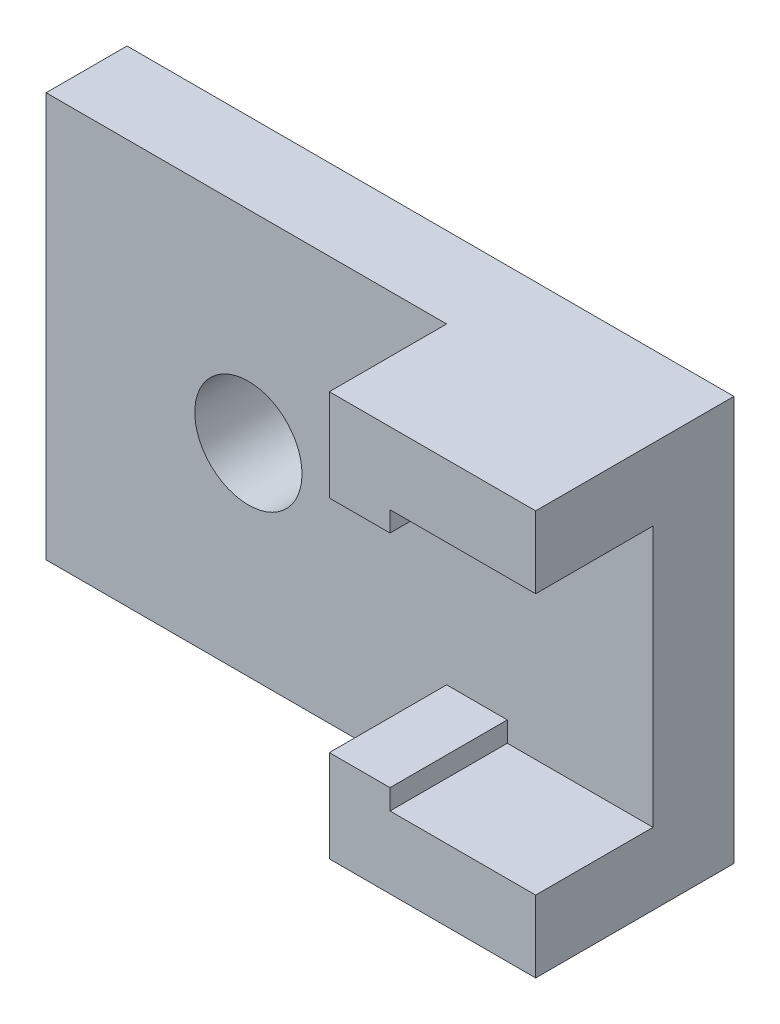
ISO-10303-21;
HEADER;
FILE_DESCRIPTION(('STEP AP214'),'2;1');
FILE_NAME('part.step','',(''),(''),'','','');
FILE_SCHEMA(('AUTOMOTIVE_DESIGN { 1 0 10303 214 1 1 1 1 }'));
ENDSEC;
DATA;
#1=APPLICATION_CONTEXT('core data for automotive mechanical design processes');
#2=APPLICATION_PROTOCOL_DEFINITION('international standard','automotive_design',2000,#1);
#3=PRODUCT_CONTEXT('',#1,'mechanical');
#4=PRODUCT('Part','Part','',(#3));
#5=PRODUCT_RELATED_PRODUCT_CATEGORY('part','',(#4));
#6=PRODUCT_DEFINITION_FORMATION('','',#4);
#7=PRODUCT_DEFINITION_CONTEXT('part definition',#1,'design');
#8=PRODUCT_DEFINITION('design','',#6,#7);
#9=PRODUCT_DEFINITION_SHAPE('','',#8);
#10=(LENGTH_UNIT() NAMED_UNIT(*) SI_UNIT(.MILLI.,.METRE.));
#11=(NAMED_UNIT(*) PLANE_ANGLE_UNIT() SI_UNIT($,.RADIAN.));
#12=(NAMED_UNIT(*) SI_UNIT($,.STERADIAN.) SOLID_ANGLE_UNIT());
#13=UNCERTAINTY_MEASURE_WITH_UNIT(LENGTH_MEASURE(1.E-05),#10,'distance_accuracy_value','');
#14=(GEOMETRIC_REPRESENTATION_CONTEXT(3) GLOBAL_UNCERTAINTY_ASSIGNED_CONTEXT((#13)) GLOBAL_UNIT_ASSIGNED_CONTEXT((#10,
#11,#12)) REPRESENTATION_CONTEXT('',''));
#15=CARTESIAN_POINT('',(0.,0.,0.));
#16=DIRECTION('',(0.,0.,1.));
#17=DIRECTION('',(1.,0.,0.));
#18=AXIS2_PLACEMENT_3D('',#15,#16,#17);
#19=CARTESIAN_POINT('',(0.,0.,4.));
#20=DIRECTION('',(1.,0.,0.));
#21=DIRECTION('',(0.,0.,-1.));
#22=AXIS2_PLACEMENT_3D('',#19,#20,#21);
#23=PLANE('',#22);
#24=DIRECTION('',(0.,-1.,0.));
#25=VECTOR('',#24,1.);
#26=CARTESIAN_POINT('',(0.,0.,0.));
#27=LINE('',#26,#25);
#28=CARTESIAN_POINT('',(0.,0.,0.));
#29=VERTEX_POINT('',#28);
#30=CARTESIAN_POINT('',(0.,-20.,0.));
#31=VERTEX_POINT('',#30);
#32=EDGE_CURVE('E226',#29,#31,#27,.T.);
#33=ORIENTED_EDGE('',*,*,#32,.T.);
#34=DIRECTION('',(0.,0.,-1.));
#35=VECTOR('',#34,1.);
#36=CARTESIAN_POINT('',(0.,-20.,4.));
#37=LINE('',#36,#35);
#38=CARTESIAN_POINT('',(0.,-20.,4.));
#39=VERTEX_POINT('',#38);
#40=EDGE_CURVE('E11',#39,#31,#37,.T.);
#41=ORIENTED_EDGE('',*,*,#40,.F.);
#42=DIRECTION('',(0.,-1.,0.));
#43=VECTOR('',#42,1.);
#44=CARTESIAN_POINT('',(0.,0.,4.));
#45=LINE('',#44,#43);
#46=CARTESIAN_POINT('',(0.,0.,4.));
#47=VERTEX_POINT('',#46);
#48=EDGE_CURVE('E229',#47,#39,#45,.T.);
#49=ORIENTED_EDGE('',*,*,#48,.F.);
#50=DIRECTION('',(0.,0.,-1.));
#51=VECTOR('',#50,1.);
#52=CARTESIAN_POINT('',(0.,0.,4.));
#53=LINE('',#52,#51);
#54=EDGE_CURVE('E239',#47,#29,#53,.T.);
#55=ORIENTED_EDGE('',*,*,#54,.T.);
#56=EDGE_LOOP('',(#33,#41,#49,#55));
#57=FACE_BOUND('',#56,.T.);
#58=ADVANCED_FACE('F35',(#57),#23,.F.);
#59=CARTESIAN_POINT('',(0.,-20.,4.));
#60=DIRECTION('',(0.,1.,0.));
#61=DIRECTION('',(0.,0.,1.));
#62=AXIS2_PLACEMENT_3D('',#59,#60,#61);
#63=PLANE('',#62);
#64=DIRECTION('',(1.,0.,0.));
#65=VECTOR('',#64,1.);
#66=CARTESIAN_POINT('',(0.,-20.,0.));
#67=LINE('',#66,#65);
#68=CARTESIAN_POINT('',(30.,-20.,0.));
#69=VERTEX_POINT('',#68);
#70=EDGE_CURVE('E242',#31,#69,#67,.T.);
#71=ORIENTED_EDGE('',*,*,#70,.T.);
#72=DIRECTION('',(0.,0.,-1.));
#73=VECTOR('',#72,1.);
#74=CARTESIAN_POINT('',(30.,-20.,4.));
#75=LINE('',#74,#73);
#76=CARTESIAN_POINT('',(30.,-20.,9.8));
#77=VERTEX_POINT('',#76);
#78=EDGE_CURVE('E42',#77,#69,#75,.T.);
#79=ORIENTED_EDGE('',*,*,#78,.F.);
#80=DIRECTION('',(1.,0.,0.));
#81=VECTOR('',#80,1.);
#82=CARTESIAN_POINT('',(0.,-20.,9.8));
#83=LINE('',#82,#81);
#84=CARTESIAN_POINT('',(19.8,-20.,9.8));
#85=VERTEX_POINT('',#84);
#86=EDGE_CURVE('E148',#85,#77,#83,.T.);
#87=ORIENTED_EDGE('',*,*,#86,.F.);
#88=DIRECTION('',(0.,0.,-1.));
#89=VECTOR('',#88,1.);
#90=CARTESIAN_POINT('',(19.8,-20.,9.8));
#91=LINE('',#90,#89);
#92=CARTESIAN_POINT('',(19.8,-20.,4.));
#93=VERTEX_POINT('',#92);
#94=EDGE_CURVE('E135',#85,#93,#91,.T.);
#95=ORIENTED_EDGE('',*,*,#94,.T.);
#96=DIRECTION('',(1.,0.,0.));
#97=VECTOR('',#96,1.);
#98=CARTESIAN_POINT('',(0.,-20.,4.));
#99=LINE('',#98,#97);
#100=EDGE_CURVE('E232',#39,#93,#99,.T.);
#101=ORIENTED_EDGE('',*,*,#100,.F.);
#102=ORIENTED_EDGE('',*,*,#40,.T.);
#103=EDGE_LOOP('',(#71,#79,#87,#95,#101,#102));
#104=FACE_BOUND('',#103,.T.);
#105=ADVANCED_FACE('F149',(#104),#63,.F.);
#106=CARTESIAN_POINT('',(30.,0.,4.));
#107=DIRECTION('',(-1.,0.,0.));
#108=DIRECTION('',(0.,-1.,0.));
#109=AXIS2_PLACEMENT_3D('',#106,#107,#108);
#110=PLANE('',#109);
#111=DIRECTION('',(0.,1.,0.));
#112=VECTOR('',#111,1.);
#113=CARTESIAN_POINT('',(30.,0.,0.));
#114=LINE('',#113,#112);
#115=CARTESIAN_POINT('',(30.,0.,0.));
#116=VERTEX_POINT('',#115);
#117=EDGE_CURVE('E244',#69,#116,#114,.T.);
#118=ORIENTED_EDGE('',*,*,#117,.T.);
#119=DIRECTION('',(0.,0.,-1.));
#120=VECTOR('',#119,1.);
#121=CARTESIAN_POINT('',(30.,0.,4.));
#122=LINE('',#121,#120);
#123=CARTESIAN_POINT('',(30.,0.,9.8));
#124=VERTEX_POINT('',#123);
#125=EDGE_CURVE('E249',#124,#116,#122,.T.);
#126=ORIENTED_EDGE('',*,*,#125,.F.);
#127=DIRECTION('',(0.,1.,0.));
#128=VECTOR('',#127,1.);
#129=CARTESIAN_POINT('',(30.,0.,9.8));
#130=LINE('',#129,#128);
#131=CARTESIAN_POINT('',(30.,-3.55,9.8));
#132=VERTEX_POINT('',#131);
#133=EDGE_CURVE('E198',#132,#124,#130,.T.);
#134=ORIENTED_EDGE('',*,*,#133,.F.);
#135=DIRECTION('',(0.,0.,-1.));
#136=VECTOR('',#135,1.);
#137=CARTESIAN_POINT('',(30.,-3.55,9.8));
#138=LINE('',#137,#136);
#139=CARTESIAN_POINT('',(30.,-3.55,4.));
#140=VERTEX_POINT('',#139);
#141=EDGE_CURVE('E201',#132,#140,#138,.T.);
#142=ORIENTED_EDGE('',*,*,#141,.T.);
#143=DIRECTION('',(0.,1.,0.));
#144=VECTOR('',#143,1.);
#145=CARTESIAN_POINT('',(30.,0.,4.));
#146=LINE('',#145,#144);
#147=CARTESIAN_POINT('',(30.,-16.45,4.));
#148=VERTEX_POINT('',#147);
#149=EDGE_CURVE('E235',#148,#140,#146,.T.);
#150=ORIENTED_EDGE('',*,*,#149,.F.);
#151=DIRECTION('',(0.,0.,-1.));
#152=VECTOR('',#151,1.);
#153=CARTESIAN_POINT('',(30.,-16.45,9.8));
#154=LINE('',#153,#152);
#155=CARTESIAN_POINT('',(30.,-16.45,9.8));
#156=VERTEX_POINT('',#155);
#157=EDGE_CURVE('E145',#156,#148,#154,.T.);
#158=ORIENTED_EDGE('',*,*,#157,.F.);
#159=DIRECTION('',(0.,1.,0.));
#160=VECTOR('',#159,1.);
#161=CARTESIAN_POINT('',(30.,0.,9.8));
#162=LINE('',#161,#160);
#163=EDGE_CURVE('E153',#77,#156,#162,.T.);
#164=ORIENTED_EDGE('',*,*,#163,.F.);
#165=ORIENTED_EDGE('',*,*,#78,.T.);
#166=EDGE_LOOP('',(#118,#126,#134,#142,#150,#158,#164,#165));
#167=FACE_BOUND('',#166,.T.);
#168=ADVANCED_FACE('F253',(#167),#110,.F.);
#169=CARTESIAN_POINT('',(0.,0.,4.));
#170=DIRECTION('',(0.,-1.,0.));
#171=DIRECTION('',(0.,0.,-1.));
#172=AXIS2_PLACEMENT_3D('',#169,#170,#171);
#173=PLANE('',#172);
#174=DIRECTION('',(-1.,0.,0.));
#175=VECTOR('',#174,1.);
#176=CARTESIAN_POINT('',(0.,0.,0.));
#177=LINE('',#176,#175);
#178=EDGE_CURVE('E233',#116,#29,#177,.T.);
#179=ORIENTED_EDGE('',*,*,#178,.T.);
#180=ORIENTED_EDGE('',*,*,#54,.F.);
#181=DIRECTION('',(-1.,0.,0.));
#182=VECTOR('',#181,1.);
#183=CARTESIAN_POINT('',(0.,0.,4.));
#184=LINE('',#183,#182);
#185=CARTESIAN_POINT('',(19.8,0.,4.));
#186=VERTEX_POINT('',#185);
#187=EDGE_CURVE('E237',#186,#47,#184,.T.);
#188=ORIENTED_EDGE('',*,*,#187,.F.);
#189=DIRECTION('',(0.,0.,-1.));
#190=VECTOR('',#189,1.);
#191=CARTESIAN_POINT('',(19.8,0.,9.8));
#192=LINE('',#191,#190);
#193=CARTESIAN_POINT('',(19.8,0.,9.8));
#194=VERTEX_POINT('',#193);
#195=EDGE_CURVE('E219',#194,#186,#192,.T.);
#196=ORIENTED_EDGE('',*,*,#195,.F.);
#197=DIRECTION('',(-1.,0.,0.));
#198=VECTOR('',#197,1.);
#199=CARTESIAN_POINT('',(0.,0.,9.8));
#200=LINE('',#199,#198);
#201=EDGE_CURVE('E185',#124,#194,#200,.T.);
#202=ORIENTED_EDGE('',*,*,#201,.F.);
#203=ORIENTED_EDGE('',*,*,#125,.T.);
#204=EDGE_LOOP('',(#179,#180,#188,#196,#202,#203));
#205=FACE_BOUND('',#204,.T.);
#206=ADVANCED_FACE('F261',(#205),#173,.F.);
#207=CARTESIAN_POINT('',(0.,0.,4.));
#208=DIRECTION('',(0.,0.,1.));
#209=DIRECTION('',(1.,0.,0.));
#210=AXIS2_PLACEMENT_3D('',#207,#208,#209);
#211=PLANE('',#210);
#212=DIRECTION('',(0.,1.,0.));
#213=VECTOR('',#212,1.);
#214=CARTESIAN_POINT('',(19.8,0.,4.));
#215=LINE('',#214,#213);
#216=CARTESIAN_POINT('',(19.8,-15.45,4.));
#217=VERTEX_POINT('',#216);
#218=EDGE_CURVE('E141',#93,#217,#215,.T.);
#219=ORIENTED_EDGE('',*,*,#218,.T.);
#220=DIRECTION('',(-1.,0.,0.));
#221=VECTOR('',#220,1.);
#222=CARTESIAN_POINT('',(0.,-15.45,4.));
#223=LINE('',#222,#221);
#224=CARTESIAN_POINT('',(22.8,-15.45,4.));
#225=VERTEX_POINT('',#224);
#226=EDGE_CURVE('E160',#225,#217,#223,.T.);
#227=ORIENTED_EDGE('',*,*,#226,.F.);
#228=DIRECTION('',(0.,-1.,0.));
#229=VECTOR('',#228,1.);
#230=CARTESIAN_POINT('',(22.8,0.,4.));
#231=LINE('',#230,#229);
#232=CARTESIAN_POINT('',(22.8,-16.45,4.));
#233=VERTEX_POINT('',#232);
#234=EDGE_CURVE('E49',#225,#233,#231,.T.);
#235=ORIENTED_EDGE('',*,*,#234,.T.);
#236=DIRECTION('',(1.,0.,0.));
#237=VECTOR('',#236,1.);
#238=CARTESIAN_POINT('',(0.,-16.45,4.));
#239=LINE('',#238,#237);
#240=EDGE_CURVE('E175',#233,#148,#239,.T.);
#241=ORIENTED_EDGE('',*,*,#240,.T.);
#242=ORIENTED_EDGE('',*,*,#149,.T.);
#243=DIRECTION('',(1.,0.,0.));
#244=VECTOR('',#243,1.);
#245=CARTESIAN_POINT('',(0.,-3.55,4.));
#246=LINE('',#245,#244);
#247=CARTESIAN_POINT('',(22.8,-3.55,4.));
#248=VERTEX_POINT('',#247);
#249=EDGE_CURVE('E57',#248,#140,#246,.T.);
#250=ORIENTED_EDGE('',*,*,#249,.F.);
#251=DIRECTION('',(0.,-1.,0.));
#252=VECTOR('',#251,1.);
#253=CARTESIAN_POINT('',(22.8,0.,4.));
#254=LINE('',#253,#252);
#255=CARTESIAN_POINT('',(22.8,-4.55,4.));
#256=VERTEX_POINT('',#255);
#257=EDGE_CURVE('E206',#248,#256,#254,.T.);
#258=ORIENTED_EDGE('',*,*,#257,.T.);
#259=DIRECTION('',(-1.,0.,0.));
#260=VECTOR('',#259,1.);
#261=CARTESIAN_POINT('',(0.,-4.55,4.));
#262=LINE('',#261,#260);
#263=CARTESIAN_POINT('',(19.8,-4.55,4.));
#264=VERTEX_POINT('',#263);
#265=EDGE_CURVE('E204',#256,#264,#262,.T.);
#266=ORIENTED_EDGE('',*,*,#265,.T.);
#267=DIRECTION('',(0.,-1.,0.));
#268=VECTOR('',#267,1.);
#269=CARTESIAN_POINT('',(19.8,0.,4.));
#270=LINE('',#269,#268);
#271=EDGE_CURVE('E144',#186,#264,#270,.T.);
#272=ORIENTED_EDGE('',*,*,#271,.F.);
#273=ORIENTED_EDGE('',*,*,#187,.T.);
#274=ORIENTED_EDGE('',*,*,#48,.T.);
#275=ORIENTED_EDGE('',*,*,#100,.T.);
#276=EDGE_LOOP('',(#219,#227,#235,#241,#242,#250,#258,#266,#272,#273,#274,#275));
#277=FACE_BOUND('',#276,.T.);
#278=CARTESIAN_POINT('',(10.,-10.,4.));
#279=DIRECTION('',(0.,0.,1.));
#280=DIRECTION('',(1.,0.,0.));
#281=AXIS2_PLACEMENT_3D('',#278,#279,#280);
#282=CIRCLE('',#281,2.65);
#283=CARTESIAN_POINT('',(12.65,-10.,4.));
#284=VERTEX_POINT('',#283);
#285=EDGE_CURVE('E222',#284,#284,#282,.T.);
#286=ORIENTED_EDGE('',*,*,#285,.F.);
#287=EDGE_LOOP('',(#286));
#288=FACE_BOUND('',#287,.T.);
#289=ADVANCED_FACE('F267',(#277,#288),#211,.T.);
#290=CARTESIAN_POINT('',(0.,0.,0.));
#291=DIRECTION('',(0.,0.,1.));
#292=DIRECTION('',(1.,0.,0.));
#293=AXIS2_PLACEMENT_3D('',#290,#291,#292);
#294=PLANE('',#293);
#295=CARTESIAN_POINT('',(10.,-10.,0.));
#296=DIRECTION('',(0.,0.,1.));
#297=DIRECTION('',(1.,0.,0.));
#298=AXIS2_PLACEMENT_3D('',#295,#296,#297);
#299=CIRCLE('',#298,2.65);
#300=CARTESIAN_POINT('',(12.65,-10.,0.));
#301=VERTEX_POINT('',#300);
#302=EDGE_CURVE('E223',#301,#301,#299,.T.);
#303=ORIENTED_EDGE('',*,*,#302,.T.);
#304=EDGE_LOOP('',(#303));
#305=FACE_BOUND('',#304,.T.);
#306=ORIENTED_EDGE('',*,*,#32,.F.);
#307=ORIENTED_EDGE('',*,*,#178,.F.);
#308=ORIENTED_EDGE('',*,*,#117,.F.);
#309=ORIENTED_EDGE('',*,*,#70,.F.);
#310=EDGE_LOOP('',(#306,#307,#308,#309));
#311=FACE_BOUND('',#310,.T.);
#312=ADVANCED_FACE('F258',(#305,#311),#294,.F.);
#313=CARTESIAN_POINT('',(10.,-10.,0.));
#314=DIRECTION('',(0.,0.,1.));
#315=DIRECTION('',(1.,0.,0.));
#316=AXIS2_PLACEMENT_3D('',#313,#314,#315);
#317=CYLINDRICAL_SURFACE('',#316,2.65);
#318=ORIENTED_EDGE('',*,*,#302,.F.);
#319=EDGE_LOOP('',(#318));
#320=FACE_BOUND('',#319,.T.);
#321=ORIENTED_EDGE('',*,*,#285,.T.);
#322=EDGE_LOOP('',(#321));
#323=FACE_BOUND('',#322,.T.);
#324=ADVANCED_FACE('F296',(#320,#323),#317,.F.);
#325=CARTESIAN_POINT('',(19.8,0.,9.8));
#326=DIRECTION('',(1.,0.,0.));
#327=DIRECTION('',(0.,0.,-1.));
#328=AXIS2_PLACEMENT_3D('',#325,#326,#327);
#329=PLANE('',#328);
#330=ORIENTED_EDGE('',*,*,#271,.T.);
#331=DIRECTION('',(0.,0.,-1.));
#332=VECTOR('',#331,1.);
#333=CARTESIAN_POINT('',(19.8,-4.55,9.8));
#334=LINE('',#333,#332);
#335=CARTESIAN_POINT('',(19.8,-4.55,9.8));
#336=VERTEX_POINT('',#335);
#337=EDGE_CURVE('E216',#336,#264,#334,.T.);
#338=ORIENTED_EDGE('',*,*,#337,.F.);
#339=DIRECTION('',(0.,-1.,0.));
#340=VECTOR('',#339,1.);
#341=CARTESIAN_POINT('',(19.8,0.,9.8));
#342=LINE('',#341,#340);
#343=EDGE_CURVE('E188',#194,#336,#342,.T.);
#344=ORIENTED_EDGE('',*,*,#343,.F.);
#345=ORIENTED_EDGE('',*,*,#195,.T.);
#346=EDGE_LOOP('',(#330,#338,#344,#345));
#347=FACE_BOUND('',#346,.T.);
#348=ADVANCED_FACE('F271',(#347),#329,.F.);
#349=CARTESIAN_POINT('',(0.,-4.55,9.8));
#350=DIRECTION('',(0.,-1.,0.));
#351=DIRECTION('',(0.,0.,-1.));
#352=AXIS2_PLACEMENT_3D('',#349,#350,#351);
#353=PLANE('',#352);
#354=ORIENTED_EDGE('',*,*,#265,.F.);
#355=DIRECTION('',(0.,0.,-1.));
#356=VECTOR('',#355,1.);
#357=CARTESIAN_POINT('',(22.8,-4.55,9.8));
#358=LINE('',#357,#356);
#359=CARTESIAN_POINT('',(22.8,-4.55,9.8));
#360=VERTEX_POINT('',#359);
#361=EDGE_CURVE('E213',#360,#256,#358,.T.);
#362=ORIENTED_EDGE('',*,*,#361,.F.);
#363=DIRECTION('',(-1.,0.,0.));
#364=VECTOR('',#363,1.);
#365=CARTESIAN_POINT('',(0.,-4.55,9.8));
#366=LINE('',#365,#364);
#367=EDGE_CURVE('E190',#360,#336,#366,.T.);
#368=ORIENTED_EDGE('',*,*,#367,.T.);
#369=ORIENTED_EDGE('',*,*,#337,.T.);
#370=EDGE_LOOP('',(#354,#362,#368,#369));
#371=FACE_BOUND('',#370,.T.);
#372=ADVANCED_FACE('F288',(#371),#353,.T.);
#373=CARTESIAN_POINT('',(22.8,0.,9.8));
#374=DIRECTION('',(1.,0.,0.));
#375=DIRECTION('',(0.,0.,-1.));
#376=AXIS2_PLACEMENT_3D('',#373,#374,#375);
#377=PLANE('',#376);
#378=ORIENTED_EDGE('',*,*,#257,.F.);
#379=DIRECTION('',(0.,0.,-1.));
#380=VECTOR('',#379,1.);
#381=CARTESIAN_POINT('',(22.8,-3.55,9.8));
#382=LINE('',#381,#380);
#383=CARTESIAN_POINT('',(22.8,-3.55,9.8));
#384=VERTEX_POINT('',#383);
#385=EDGE_CURVE('E211',#384,#248,#382,.T.);
#386=ORIENTED_EDGE('',*,*,#385,.F.);
#387=DIRECTION('',(0.,-1.,0.));
#388=VECTOR('',#387,1.);
#389=CARTESIAN_POINT('',(22.8,0.,9.8));
#390=LINE('',#389,#388);
#391=EDGE_CURVE('E193',#384,#360,#390,.T.);
#392=ORIENTED_EDGE('',*,*,#391,.T.);
#393=ORIENTED_EDGE('',*,*,#361,.T.);
#394=EDGE_LOOP('',(#378,#386,#392,#393));
#395=FACE_BOUND('',#394,.T.);
#396=ADVANCED_FACE('F285',(#395),#377,.T.);
#397=CARTESIAN_POINT('',(0.,-3.55,9.8));
#398=DIRECTION('',(0.,1.,0.));
#399=DIRECTION('',(0.,0.,1.));
#400=AXIS2_PLACEMENT_3D('',#397,#398,#399);
#401=PLANE('',#400);
#402=ORIENTED_EDGE('',*,*,#249,.T.);
#403=ORIENTED_EDGE('',*,*,#141,.F.);
#404=DIRECTION('',(1.,0.,0.));
#405=VECTOR('',#404,1.);
#406=CARTESIAN_POINT('',(0.,-3.55,9.8));
#407=LINE('',#406,#405);
#408=EDGE_CURVE('E196',#384,#132,#407,.T.);
#409=ORIENTED_EDGE('',*,*,#408,.F.);
#410=ORIENTED_EDGE('',*,*,#385,.T.);
#411=EDGE_LOOP('',(#402,#403,#409,#410));
#412=FACE_BOUND('',#411,.T.);
#413=ADVANCED_FACE('F282',(#412),#401,.F.);
#414=CARTESIAN_POINT('',(0.,0.,9.8));
#415=DIRECTION('',(0.,0.,1.));
#416=DIRECTION('',(1.,0.,0.));
#417=AXIS2_PLACEMENT_3D('',#414,#415,#416);
#418=PLANE('',#417);
#419=ORIENTED_EDGE('',*,*,#201,.T.);
#420=ORIENTED_EDGE('',*,*,#343,.T.);
#421=ORIENTED_EDGE('',*,*,#367,.F.);
#422=ORIENTED_EDGE('',*,*,#391,.F.);
#423=ORIENTED_EDGE('',*,*,#408,.T.);
#424=ORIENTED_EDGE('',*,*,#133,.T.);
#425=EDGE_LOOP('',(#419,#420,#421,#422,#423,#424));
#426=FACE_BOUND('',#425,.T.);
#427=ADVANCED_FACE('F275',(#426),#418,.T.);
#428=CARTESIAN_POINT('',(19.8,0.,9.8));
#429=DIRECTION('',(-1.,0.,0.));
#430=DIRECTION('',(0.,0.,1.));
#431=AXIS2_PLACEMENT_3D('',#428,#429,#430);
#432=PLANE('',#431);
#433=ORIENTED_EDGE('',*,*,#218,.F.);
#434=ORIENTED_EDGE('',*,*,#94,.F.);
#435=DIRECTION('',(0.,1.,0.));
#436=VECTOR('',#435,1.);
#437=CARTESIAN_POINT('',(19.8,0.,9.8));
#438=LINE('',#437,#436);
#439=CARTESIAN_POINT('',(19.8,-15.45,9.8));
#440=VERTEX_POINT('',#439);
#441=EDGE_CURVE('E139',#85,#440,#438,.T.);
#442=ORIENTED_EDGE('',*,*,#441,.T.);
#443=DIRECTION('',(0.,0.,-1.));
#444=VECTOR('',#443,1.);
#445=CARTESIAN_POINT('',(19.8,-15.45,9.8));
#446=LINE('',#445,#444);
#447=EDGE_CURVE('E173',#440,#217,#446,.T.);
#448=ORIENTED_EDGE('',*,*,#447,.T.);
#449=EDGE_LOOP('',(#433,#434,#442,#448));
#450=FACE_BOUND('',#449,.T.);
#451=ADVANCED_FACE('F137',(#450),#432,.T.);
#452=CARTESIAN_POINT('',(0.,-16.45,9.8));
#453=DIRECTION('',(0.,1.,0.));
#454=DIRECTION('',(0.,0.,1.));
#455=AXIS2_PLACEMENT_3D('',#452,#453,#454);
#456=PLANE('',#455);
#457=ORIENTED_EDGE('',*,*,#240,.F.);
#458=DIRECTION('',(0.,0.,-1.));
#459=VECTOR('',#458,1.);
#460=CARTESIAN_POINT('',(22.8,-16.45,9.8));
#461=LINE('',#460,#459);
#462=CARTESIAN_POINT('',(22.8,-16.45,9.8));
#463=VERTEX_POINT('',#462);
#464=EDGE_CURVE('E182',#463,#233,#461,.T.);
#465=ORIENTED_EDGE('',*,*,#464,.F.);
#466=DIRECTION('',(1.,0.,0.));
#467=VECTOR('',#466,1.);
#468=CARTESIAN_POINT('',(0.,-16.45,9.8));
#469=LINE('',#468,#467);
#470=EDGE_CURVE('E166',#463,#156,#469,.T.);
#471=ORIENTED_EDGE('',*,*,#470,.T.);
#472=ORIENTED_EDGE('',*,*,#157,.T.);
#473=EDGE_LOOP('',(#457,#465,#471,#472));
#474=FACE_BOUND('',#473,.T.);
#475=ADVANCED_FACE('F371',(#474),#456,.T.);
#476=CARTESIAN_POINT('',(22.8,0.,9.8));
#477=DIRECTION('',(1.,0.,0.));
#478=DIRECTION('',(0.,0.,-1.));
#479=AXIS2_PLACEMENT_3D('',#476,#477,#478);
#480=PLANE('',#479);
#481=ORIENTED_EDGE('',*,*,#234,.F.);
#482=DIRECTION('',(0.,0.,-1.));
#483=VECTOR('',#482,1.);
#484=CARTESIAN_POINT('',(22.8,-15.45,9.8));
#485=LINE('',#484,#483);
#486=CARTESIAN_POINT('',(22.8,-15.45,9.8));
#487=VERTEX_POINT('',#486);
#488=EDGE_CURVE('E180',#487,#225,#485,.T.);
#489=ORIENTED_EDGE('',*,*,#488,.F.);
#490=DIRECTION('',(0.,-1.,0.));
#491=VECTOR('',#490,1.);
#492=CARTESIAN_POINT('',(22.8,0.,9.8));
#493=LINE('',#492,#491);
#494=EDGE_CURVE('E169',#487,#463,#493,.T.);
#495=ORIENTED_EDGE('',*,*,#494,.T.);
#496=ORIENTED_EDGE('',*,*,#464,.T.);
#497=EDGE_LOOP('',(#481,#489,#495,#496));
#498=FACE_BOUND('',#497,.T.);
#499=ADVANCED_FACE('F381',(#498),#480,.T.);
#500=CARTESIAN_POINT('',(0.,-15.45,9.8));
#501=DIRECTION('',(0.,-1.,0.));
#502=DIRECTION('',(0.,0.,-1.));
#503=AXIS2_PLACEMENT_3D('',#500,#501,#502);
#504=PLANE('',#503);
#505=ORIENTED_EDGE('',*,*,#226,.T.);
#506=ORIENTED_EDGE('',*,*,#447,.F.);
#507=DIRECTION('',(-1.,0.,0.));
#508=VECTOR('',#507,1.);
#509=CARTESIAN_POINT('',(0.,-15.45,9.8));
#510=LINE('',#509,#508);
#511=EDGE_CURVE('E158',#487,#440,#510,.T.);
#512=ORIENTED_EDGE('',*,*,#511,.F.);
#513=ORIENTED_EDGE('',*,*,#488,.T.);
#514=EDGE_LOOP('',(#505,#506,#512,#513));
#515=FACE_BOUND('',#514,.T.);
#516=ADVANCED_FACE('F392',(#515),#504,.F.);
#517=CARTESIAN_POINT('',(0.,0.,9.8));
#518=DIRECTION('',(0.,0.,1.));
#519=DIRECTION('',(1.,0.,0.));
#520=AXIS2_PLACEMENT_3D('',#517,#518,#519);
#521=PLANE('',#520);
#522=ORIENTED_EDGE('',*,*,#441,.F.);
#523=ORIENTED_EDGE('',*,*,#86,.T.);
#524=ORIENTED_EDGE('',*,*,#163,.T.);
#525=ORIENTED_EDGE('',*,*,#470,.F.);
#526=ORIENTED_EDGE('',*,*,#494,.F.);
#527=ORIENTED_EDGE('',*,*,#511,.T.);
#528=EDGE_LOOP('',(#522,#523,#524,#525,#526,#527));
#529=FACE_BOUND('',#528,.T.);
#530=ADVANCED_FACE('F155',(#529),#521,.T.);
#531=CLOSED_SHELL('',(#58,#105,#168,#206,#289,#312,#324,#348,#372,#396,#413,#427,#451,#475,#499,
#516,#530));
#532=MANIFOLD_SOLID_BREP('B2',#531);
#533=ADVANCED_BREP_SHAPE_REPRESENTATION('',(#18,#532),#14);
#534=SHAPE_DEFINITION_REPRESENTATION(#9,#533);
ENDSEC;
END-ISO-10303-21;
